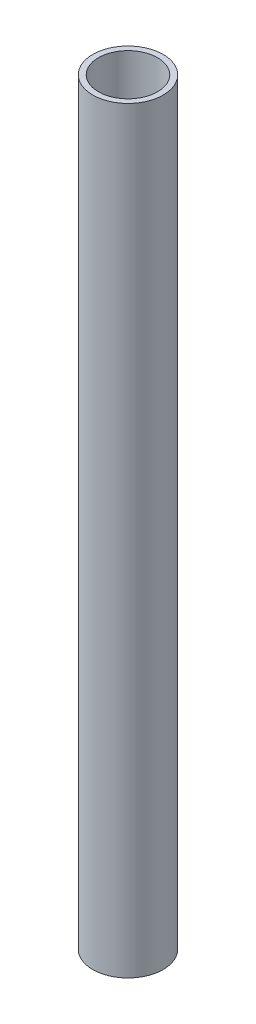
ISO-10303-21;
HEADER;
FILE_DESCRIPTION(('STEP AP214'),'2;1');
FILE_NAME('part.step','',(''),(''),'','','');
FILE_SCHEMA(('AUTOMOTIVE_DESIGN { 1 0 10303 214 1 1 1 1 }'));
ENDSEC;
DATA;
#1=APPLICATION_CONTEXT('core data for automotive mechanical design processes');
#2=APPLICATION_PROTOCOL_DEFINITION('international standard','automotive_design',2000,#1);
#3=PRODUCT_CONTEXT('',#1,'mechanical');
#4=PRODUCT('Part','Part','',(#3));
#5=PRODUCT_RELATED_PRODUCT_CATEGORY('part','',(#4));
#6=PRODUCT_DEFINITION_FORMATION('','',#4);
#7=PRODUCT_DEFINITION_CONTEXT('part definition',#1,'design');
#8=PRODUCT_DEFINITION('design','',#6,#7);
#9=PRODUCT_DEFINITION_SHAPE('','',#8);
#10=(LENGTH_UNIT() NAMED_UNIT(*) SI_UNIT(.MILLI.,.METRE.));
#11=(NAMED_UNIT(*) PLANE_ANGLE_UNIT() SI_UNIT($,.RADIAN.));
#12=(NAMED_UNIT(*) SI_UNIT($,.STERADIAN.) SOLID_ANGLE_UNIT());
#13=UNCERTAINTY_MEASURE_WITH_UNIT(LENGTH_MEASURE(1.E-05),#10,'distance_accuracy_value','');
#14=(GEOMETRIC_REPRESENTATION_CONTEXT(3) GLOBAL_UNCERTAINTY_ASSIGNED_CONTEXT((#13)) GLOBAL_UNIT_ASSIGNED_CONTEXT((#10,
#11,#12)) REPRESENTATION_CONTEXT('',''));
#15=CARTESIAN_POINT('',(0.,0.,0.));
#16=DIRECTION('',(0.,0.,1.));
#17=DIRECTION('',(1.,0.,0.));
#18=AXIS2_PLACEMENT_3D('',#15,#16,#17);
#19=CARTESIAN_POINT('',(0.,269.,0.));
#20=DIRECTION('',(0.,1.,0.));
#21=DIRECTION('',(0.,0.,1.));
#22=AXIS2_PLACEMENT_3D('',#19,#20,#21);
#23=PLANE('',#22);
#24=CARTESIAN_POINT('',(0.,269.,0.));
#25=DIRECTION('',(0.,1.,0.));
#26=DIRECTION('',(0.,0.,1.));
#27=AXIS2_PLACEMENT_3D('',#24,#25,#26);
#28=CIRCLE('',#27,12.5);
#29=CARTESIAN_POINT('',(0.,269.,12.5));
#30=VERTEX_POINT('',#29);
#31=EDGE_CURVE('E10',#30,#30,#28,.T.);
#32=ORIENTED_EDGE('',*,*,#31,.T.);
#33=EDGE_LOOP('',(#32));
#34=FACE_BOUND('',#33,.T.);
#35=CARTESIAN_POINT('',(0.,269.,0.));
#36=DIRECTION('',(0.,1.,0.));
#37=DIRECTION('',(0.,0.,1.));
#38=AXIS2_PLACEMENT_3D('',#35,#36,#37);
#39=CIRCLE('',#38,10.5);
#40=CARTESIAN_POINT('',(0.,269.,10.5));
#41=VERTEX_POINT('',#40);
#42=EDGE_CURVE('E42',#41,#41,#39,.T.);
#43=ORIENTED_EDGE('',*,*,#42,.F.);
#44=EDGE_LOOP('',(#43));
#45=FACE_BOUND('',#44,.T.);
#46=ADVANCED_FACE('F31',(#34,#45),#23,.T.);
#47=CARTESIAN_POINT('',(0.,0.,0.));
#48=DIRECTION('',(0.,1.,0.));
#49=DIRECTION('',(0.,0.,1.));
#50=AXIS2_PLACEMENT_3D('',#47,#48,#49);
#51=PLANE('',#50);
#52=CARTESIAN_POINT('',(0.,0.,0.));
#53=DIRECTION('',(0.,1.,0.));
#54=DIRECTION('',(0.,0.,1.));
#55=AXIS2_PLACEMENT_3D('',#52,#53,#54);
#56=CIRCLE('',#55,12.5);
#57=CARTESIAN_POINT('',(0.,0.,12.5));
#58=VERTEX_POINT('',#57);
#59=EDGE_CURVE('E35',#58,#58,#56,.T.);
#60=ORIENTED_EDGE('',*,*,#59,.F.);
#61=EDGE_LOOP('',(#60));
#62=FACE_BOUND('',#61,.T.);
#63=CARTESIAN_POINT('',(0.,0.,0.));
#64=DIRECTION('',(0.,1.,0.));
#65=DIRECTION('',(0.,0.,1.));
#66=AXIS2_PLACEMENT_3D('',#63,#64,#65);
#67=CIRCLE('',#66,10.5);
#68=CARTESIAN_POINT('',(0.,0.,10.5));
#69=VERTEX_POINT('',#68);
#70=EDGE_CURVE('E44',#69,#69,#67,.T.);
#71=ORIENTED_EDGE('',*,*,#70,.T.);
#72=EDGE_LOOP('',(#71));
#73=FACE_BOUND('',#72,.T.);
#74=ADVANCED_FACE('F54',(#62,#73),#51,.F.);
#75=CARTESIAN_POINT('',(0.,269.,0.));
#76=DIRECTION('',(0.,-1.,0.));
#77=DIRECTION('',(0.,0.,-1.));
#78=AXIS2_PLACEMENT_3D('',#75,#76,#77);
#79=CYLINDRICAL_SURFACE('',#78,12.5);
#80=ORIENTED_EDGE('',*,*,#31,.F.);
#81=EDGE_LOOP('',(#80));
#82=FACE_BOUND('',#81,.T.);
#83=ORIENTED_EDGE('',*,*,#59,.T.);
#84=EDGE_LOOP('',(#83));
#85=FACE_BOUND('',#84,.T.);
#86=ADVANCED_FACE('F33',(#82,#85),#79,.T.);
#87=CARTESIAN_POINT('',(0.,269.,0.));
#88=DIRECTION('',(0.,-1.,0.));
#89=DIRECTION('',(0.,0.,-1.));
#90=AXIS2_PLACEMENT_3D('',#87,#88,#89);
#91=CYLINDRICAL_SURFACE('',#90,10.5);
#92=ORIENTED_EDGE('',*,*,#42,.T.);
#93=EDGE_LOOP('',(#92));
#94=FACE_BOUND('',#93,.T.);
#95=ORIENTED_EDGE('',*,*,#70,.F.);
#96=EDGE_LOOP('',(#95));
#97=FACE_BOUND('',#96,.T.);
#98=ADVANCED_FACE('F50',(#94,#97),#91,.F.);
#99=CLOSED_SHELL('',(#46,#74,#86,#98));
#100=MANIFOLD_SOLID_BREP('B2',#99);
#101=ADVANCED_BREP_SHAPE_REPRESENTATION('',(#18,#100),#14);
#102=SHAPE_DEFINITION_REPRESENTATION(#9,#101);
ENDSEC;
END-ISO-10303-21;
